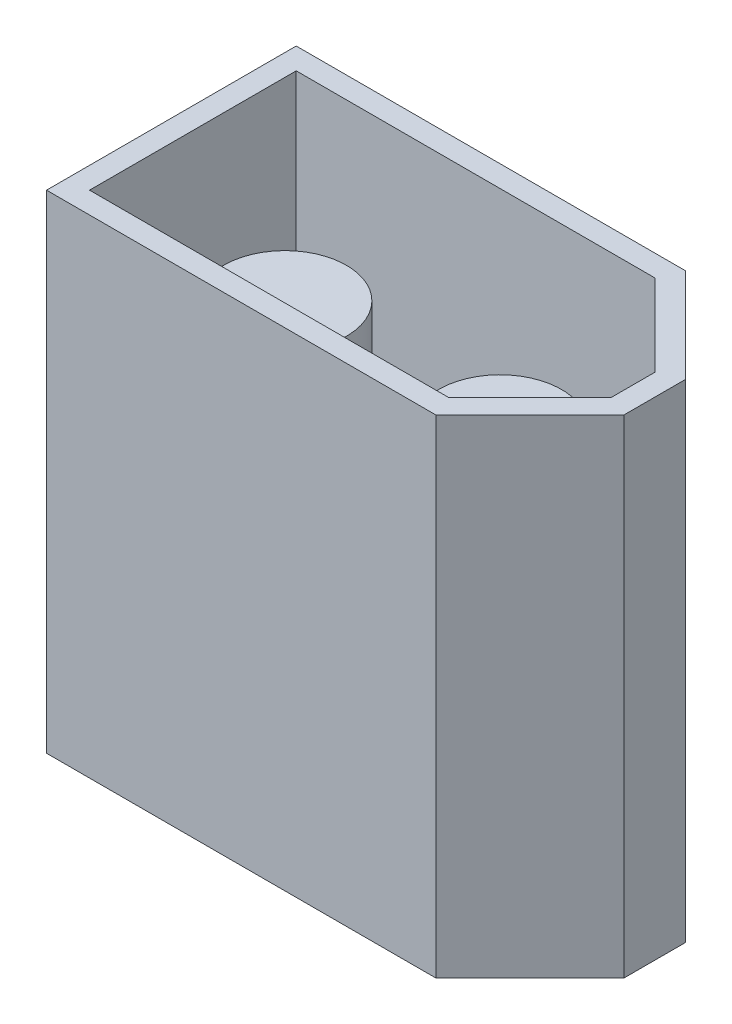
ISO-10303-21;
HEADER;
FILE_DESCRIPTION(('STEP AP214'),'2;1');
FILE_NAME('part.step','',(''),(''),'','','');
FILE_SCHEMA(('AUTOMOTIVE_DESIGN { 1 0 10303 214 1 1 1 1 }'));
ENDSEC;
DATA;
#1=APPLICATION_CONTEXT('core data for automotive mechanical design processes');
#2=APPLICATION_PROTOCOL_DEFINITION('international standard','automotive_design',2000,#1);
#3=PRODUCT_CONTEXT('',#1,'mechanical');
#4=PRODUCT('Part','Part','',(#3));
#5=PRODUCT_RELATED_PRODUCT_CATEGORY('part','',(#4));
#6=PRODUCT_DEFINITION_FORMATION('','',#4);
#7=PRODUCT_DEFINITION_CONTEXT('part definition',#1,'design');
#8=PRODUCT_DEFINITION('design','',#6,#7);
#9=PRODUCT_DEFINITION_SHAPE('','',#8);
#10=(LENGTH_UNIT() NAMED_UNIT(*) SI_UNIT(.MILLI.,.METRE.));
#11=(NAMED_UNIT(*) PLANE_ANGLE_UNIT() SI_UNIT($,.RADIAN.));
#12=(NAMED_UNIT(*) SI_UNIT($,.STERADIAN.) SOLID_ANGLE_UNIT());
#13=UNCERTAINTY_MEASURE_WITH_UNIT(LENGTH_MEASURE(1.E-05),#10,'distance_accuracy_value','');
#14=(GEOMETRIC_REPRESENTATION_CONTEXT(3) GLOBAL_UNCERTAINTY_ASSIGNED_CONTEXT((#13)) GLOBAL_UNIT_ASSIGNED_CONTEXT((#10,
#11,#12)) REPRESENTATION_CONTEXT('',''));
#15=CARTESIAN_POINT('',(0.,0.,0.));
#16=DIRECTION('',(0.,0.,1.));
#17=DIRECTION('',(1.,0.,0.));
#18=AXIS2_PLACEMENT_3D('',#15,#16,#17);
#19=CARTESIAN_POINT('',(2.83235,-1.3,0.));
#20=DIRECTION('',(0.,1.,0.));
#21=DIRECTION('',(0.,0.,1.));
#22=AXIS2_PLACEMENT_3D('',#19,#20,#21);
#23=CYLINDRICAL_SURFACE('',#22,2.);
#24=CARTESIAN_POINT('',(2.83235,-1.3,0.));
#25=DIRECTION('',(0.,1.,0.));
#26=DIRECTION('',(0.,0.,1.));
#27=AXIS2_PLACEMENT_3D('',#24,#25,#26);
#28=CIRCLE('',#27,2.);
#29=CARTESIAN_POINT('',(2.83235,-1.3,2.));
#30=VERTEX_POINT('',#29);
#31=EDGE_CURVE('E11',#30,#30,#28,.T.);
#32=ORIENTED_EDGE('',*,*,#31,.T.);
#33=EDGE_LOOP('',(#32));
#34=FACE_BOUND('',#33,.T.);
#35=CARTESIAN_POINT('',(2.83235,12.575,0.));
#36=DIRECTION('',(0.,1.,0.));
#37=DIRECTION('',(0.,0.,1.));
#38=AXIS2_PLACEMENT_3D('',#35,#36,#37);
#39=CIRCLE('',#38,2.);
#40=CARTESIAN_POINT('',(2.83235,12.575,2.));
#41=VERTEX_POINT('',#40);
#42=EDGE_CURVE('E50',#41,#41,#39,.T.);
#43=ORIENTED_EDGE('',*,*,#42,.F.);
#44=EDGE_LOOP('',(#43));
#45=FACE_BOUND('',#44,.T.);
#46=ADVANCED_FACE('F44',(#34,#45),#23,.T.);
#47=CARTESIAN_POINT('',(2.83235,-1.3,0.));
#48=DIRECTION('',(0.,1.,0.));
#49=DIRECTION('',(0.,0.,1.));
#50=AXIS2_PLACEMENT_3D('',#47,#48,#49);
#51=PLANE('',#50);
#52=ORIENTED_EDGE('',*,*,#31,.F.);
#53=EDGE_LOOP('',(#52));
#54=FACE_BOUND('',#53,.T.);
#55=ADVANCED_FACE('F59',(#54),#51,.F.);
#56=CARTESIAN_POINT('',(2.83235,12.575,0.));
#57=DIRECTION('',(0.,1.,0.));
#58=DIRECTION('',(0.,0.,1.));
#59=AXIS2_PLACEMENT_3D('',#56,#57,#58);
#60=PLANE('',#59);
#61=ORIENTED_EDGE('',*,*,#42,.T.);
#62=EDGE_LOOP('',(#61));
#63=FACE_BOUND('',#62,.T.);
#64=ADVANCED_FACE('F56',(#63),#60,.T.);
#65=CLOSED_SHELL('',(#46,#55,#64));
#66=MANIFOLD_SOLID_BREP('B2',#65);
#67=CARTESIAN_POINT('',(-4.16765,-1.3,0.));
#68=DIRECTION('',(0.,1.,0.));
#69=DIRECTION('',(0.,0.,1.));
#70=AXIS2_PLACEMENT_3D('',#67,#68,#69);
#71=CYLINDRICAL_SURFACE('',#70,2.);
#72=CARTESIAN_POINT('',(-4.16765,-1.3,0.));
#73=DIRECTION('',(0.,1.,0.));
#74=DIRECTION('',(0.,0.,1.));
#75=AXIS2_PLACEMENT_3D('',#72,#73,#74);
#76=CIRCLE('',#75,2.);
#77=CARTESIAN_POINT('',(-4.16765,-1.3,2.));
#78=VERTEX_POINT('',#77);
#79=EDGE_CURVE('E43',#78,#78,#76,.T.);
#80=ORIENTED_EDGE('',*,*,#79,.T.);
#81=EDGE_LOOP('',(#80));
#82=FACE_BOUND('',#81,.T.);
#83=CARTESIAN_POINT('',(-4.16765,12.575,0.));
#84=DIRECTION('',(0.,1.,0.));
#85=DIRECTION('',(0.,0.,1.));
#86=AXIS2_PLACEMENT_3D('',#83,#84,#85);
#87=CIRCLE('',#86,2.);
#88=CARTESIAN_POINT('',(-4.16765,12.575,2.));
#89=VERTEX_POINT('',#88);
#90=EDGE_CURVE('E100',#89,#89,#87,.T.);
#91=ORIENTED_EDGE('',*,*,#90,.F.);
#92=EDGE_LOOP('',(#91));
#93=FACE_BOUND('',#92,.T.);
#94=ADVANCED_FACE('F94',(#82,#93),#71,.T.);
#95=CARTESIAN_POINT('',(-4.16765,-1.3,0.));
#96=DIRECTION('',(0.,1.,0.));
#97=DIRECTION('',(0.,0.,1.));
#98=AXIS2_PLACEMENT_3D('',#95,#96,#97);
#99=PLANE('',#98);
#100=ORIENTED_EDGE('',*,*,#79,.F.);
#101=EDGE_LOOP('',(#100));
#102=FACE_BOUND('',#101,.T.);
#103=ADVANCED_FACE('F109',(#102),#99,.F.);
#104=CARTESIAN_POINT('',(-4.16765,12.575,0.));
#105=DIRECTION('',(0.,1.,0.));
#106=DIRECTION('',(0.,0.,1.));
#107=AXIS2_PLACEMENT_3D('',#104,#105,#106);
#108=PLANE('',#107);
#109=ORIENTED_EDGE('',*,*,#90,.T.);
#110=EDGE_LOOP('',(#109));
#111=FACE_BOUND('',#110,.T.);
#112=ADVANCED_FACE('F106',(#111),#108,.T.);
#113=CLOSED_SHELL('',(#94,#103,#112));
#114=MANIFOLD_SOLID_BREP('B6',#113);
#115=CARTESIAN_POINT('',(-7.86765,15.875,4.064));
#116=DIRECTION('',(0.,0.,-1.));
#117=DIRECTION('',(-1.,0.,0.));
#118=AXIS2_PLACEMENT_3D('',#115,#116,#117);
#119=PLANE('',#118);
#120=DIRECTION('',(1.,0.,0.));
#121=VECTOR('',#120,1.);
#122=CARTESIAN_POINT('',(-7.86765,0.,4.064));
#123=LINE('',#122,#121);
#124=CARTESIAN_POINT('',(-7.86765,0.,4.064));
#125=VERTEX_POINT('',#124);
#126=CARTESIAN_POINT('',(4.80365000000001,0.,4.064));
#127=VERTEX_POINT('',#126);
#128=EDGE_CURVE('E230',#125,#127,#123,.T.);
#129=ORIENTED_EDGE('',*,*,#128,.T.);
#130=DIRECTION('',(0.,-1.,0.));
#131=VECTOR('',#130,1.);
#132=CARTESIAN_POINT('',(4.80365000000001,15.875,4.064));
#133=LINE('',#132,#131);
#134=CARTESIAN_POINT('',(4.80365000000001,15.875,4.064));
#135=VERTEX_POINT('',#134);
#136=EDGE_CURVE('E92',#135,#127,#133,.T.);
#137=ORIENTED_EDGE('',*,*,#136,.F.);
#138=DIRECTION('',(1.,0.,0.));
#139=VECTOR('',#138,1.);
#140=CARTESIAN_POINT('',(-7.86765,15.875,4.064));
#141=LINE('',#140,#139);
#142=CARTESIAN_POINT('',(-7.86765,15.875,4.064));
#143=VERTEX_POINT('',#142);
#144=EDGE_CURVE('E242',#143,#135,#141,.T.);
#145=ORIENTED_EDGE('',*,*,#144,.F.);
#146=DIRECTION('',(0.,-1.,0.));
#147=VECTOR('',#146,1.);
#148=CARTESIAN_POINT('',(-7.86765,15.875,4.064));
#149=LINE('',#148,#147);
#150=EDGE_CURVE('E226',#143,#125,#149,.T.);
#151=ORIENTED_EDGE('',*,*,#150,.T.);
#152=EDGE_LOOP('',(#129,#137,#145,#151));
#153=FACE_BOUND('',#152,.T.);
#154=ADVANCED_FACE('F135',(#153),#119,.F.);
#155=CARTESIAN_POINT('',(4.80365000000001,15.875,4.064));
#156=DIRECTION('',(-0.707106781186549,0.,-0.707106781186546));
#157=DIRECTION('',(-0.707106781186546,0.,0.707106781186549));
#158=AXIS2_PLACEMENT_3D('',#155,#156,#157);
#159=PLANE('',#158);
#160=DIRECTION('',(0.707106781186546,0.,-0.707106781186549));
#161=VECTOR('',#160,1.);
#162=CARTESIAN_POINT('',(4.80365000000001,0.,4.064));
#163=LINE('',#162,#161);
#164=CARTESIAN_POINT('',(7.86765,0.,1.));
#165=VERTEX_POINT('',#164);
#166=EDGE_CURVE('E233',#127,#165,#163,.T.);
#167=ORIENTED_EDGE('',*,*,#166,.T.);
#168=DIRECTION('',(0.,-1.,0.));
#169=VECTOR('',#168,1.);
#170=CARTESIAN_POINT('',(7.86765,15.875,1.));
#171=LINE('',#170,#169);
#172=CARTESIAN_POINT('',(7.86765,15.875,1.));
#173=VERTEX_POINT('',#172);
#174=EDGE_CURVE('E142',#173,#165,#171,.T.);
#175=ORIENTED_EDGE('',*,*,#174,.F.);
#176=DIRECTION('',(0.707106781186546,0.,-0.707106781186549));
#177=VECTOR('',#176,1.);
#178=CARTESIAN_POINT('',(4.80365000000001,15.875,4.064));
#179=LINE('',#178,#177);
#180=EDGE_CURVE('E193',#135,#173,#179,.T.);
#181=ORIENTED_EDGE('',*,*,#180,.F.);
#182=ORIENTED_EDGE('',*,*,#136,.T.);
#183=EDGE_LOOP('',(#167,#175,#181,#182));
#184=FACE_BOUND('',#183,.T.);
#185=ADVANCED_FACE('F365',(#184),#159,.F.);
#186=CARTESIAN_POINT('',(7.86765,15.875,1.));
#187=DIRECTION('',(-1.,0.,0.));
#188=DIRECTION('',(0.,0.,1.));
#189=AXIS2_PLACEMENT_3D('',#186,#187,#188);
#190=PLANE('',#189);
#191=DIRECTION('',(0.,0.,-1.));
#192=VECTOR('',#191,1.);
#193=CARTESIAN_POINT('',(7.86765,0.,1.));
#194=LINE('',#193,#192);
#195=CARTESIAN_POINT('',(7.86765,0.,-1.));
#196=VERTEX_POINT('',#195);
#197=EDGE_CURVE('E236',#165,#196,#194,.T.);
#198=ORIENTED_EDGE('',*,*,#197,.T.);
#199=DIRECTION('',(0.,-1.,0.));
#200=VECTOR('',#199,1.);
#201=CARTESIAN_POINT('',(7.86765,15.875,-1.));
#202=LINE('',#201,#200);
#203=CARTESIAN_POINT('',(7.86765,15.875,-1.));
#204=VERTEX_POINT('',#203);
#205=EDGE_CURVE('E221',#204,#196,#202,.T.);
#206=ORIENTED_EDGE('',*,*,#205,.F.);
#207=DIRECTION('',(0.,0.,-1.));
#208=VECTOR('',#207,1.);
#209=CARTESIAN_POINT('',(7.86765,15.875,1.));
#210=LINE('',#209,#208);
#211=EDGE_CURVE('E209',#173,#204,#210,.T.);
#212=ORIENTED_EDGE('',*,*,#211,.F.);
#213=ORIENTED_EDGE('',*,*,#174,.T.);
#214=EDGE_LOOP('',(#198,#206,#212,#213));
#215=FACE_BOUND('',#214,.T.);
#216=ADVANCED_FACE('F248',(#215),#190,.F.);
#217=CARTESIAN_POINT('',(4.80365000000001,15.875,-4.064));
#218=DIRECTION('',(-0.707106781186549,0.,0.707106781186546));
#219=DIRECTION('',(0.707106781186546,0.,0.707106781186549));
#220=AXIS2_PLACEMENT_3D('',#217,#218,#219);
#221=PLANE('',#220);
#222=DIRECTION('',(-0.707106781186546,0.,-0.707106781186549));
#223=VECTOR('',#222,1.);
#224=CARTESIAN_POINT('',(4.80365000000001,0.,-4.064));
#225=LINE('',#224,#223);
#226=CARTESIAN_POINT('',(4.80365000000001,0.,-4.064));
#227=VERTEX_POINT('',#226);
#228=EDGE_CURVE('E218',#196,#227,#225,.T.);
#229=ORIENTED_EDGE('',*,*,#228,.T.);
#230=DIRECTION('',(0.,-1.,0.));
#231=VECTOR('',#230,1.);
#232=CARTESIAN_POINT('',(4.80365000000001,15.875,-4.064));
#233=LINE('',#232,#231);
#234=CARTESIAN_POINT('',(4.80365000000001,15.875,-4.064));
#235=VERTEX_POINT('',#234);
#236=EDGE_CURVE('E215',#235,#227,#233,.T.);
#237=ORIENTED_EDGE('',*,*,#236,.F.);
#238=DIRECTION('',(-0.707106781186546,0.,-0.707106781186549));
#239=VECTOR('',#238,1.);
#240=CARTESIAN_POINT('',(4.80365000000001,15.875,-4.064));
#241=LINE('',#240,#239);
#242=EDGE_CURVE('E202',#204,#235,#241,.T.);
#243=ORIENTED_EDGE('',*,*,#242,.F.);
#244=ORIENTED_EDGE('',*,*,#205,.T.);
#245=EDGE_LOOP('',(#229,#237,#243,#244));
#246=FACE_BOUND('',#245,.T.);
#247=ADVANCED_FACE('F216',(#246),#221,.F.);
#248=CARTESIAN_POINT('',(-7.86765,15.875,-4.064));
#249=DIRECTION('',(0.,0.,1.));
#250=DIRECTION('',(1.,0.,0.));
#251=AXIS2_PLACEMENT_3D('',#248,#249,#250);
#252=PLANE('',#251);
#253=DIRECTION('',(-1.,0.,0.));
#254=VECTOR('',#253,1.);
#255=CARTESIAN_POINT('',(-7.86765,0.,-4.064));
#256=LINE('',#255,#254);
#257=CARTESIAN_POINT('',(-7.86765,0.,-4.064));
#258=VERTEX_POINT('',#257);
#259=EDGE_CURVE('E239',#227,#258,#256,.T.);
#260=ORIENTED_EDGE('',*,*,#259,.T.);
#261=DIRECTION('',(0.,-1.,0.));
#262=VECTOR('',#261,1.);
#263=CARTESIAN_POINT('',(-7.86765,15.875,-4.064));
#264=LINE('',#263,#262);
#265=CARTESIAN_POINT('',(-7.86765,15.875,-4.064));
#266=VERTEX_POINT('',#265);
#267=EDGE_CURVE('E222',#266,#258,#264,.T.);
#268=ORIENTED_EDGE('',*,*,#267,.F.);
#269=DIRECTION('',(-1.,0.,0.));
#270=VECTOR('',#269,1.);
#271=CARTESIAN_POINT('',(-7.86765,15.875,-4.064));
#272=LINE('',#271,#270);
#273=EDGE_CURVE('E206',#235,#266,#272,.T.);
#274=ORIENTED_EDGE('',*,*,#273,.F.);
#275=ORIENTED_EDGE('',*,*,#236,.T.);
#276=EDGE_LOOP('',(#260,#268,#274,#275));
#277=FACE_BOUND('',#276,.T.);
#278=ADVANCED_FACE('F224',(#277),#252,.F.);
#279=CARTESIAN_POINT('',(-7.86765,15.875,-4.064));
#280=DIRECTION('',(1.,0.,0.));
#281=DIRECTION('',(0.,0.,-1.));
#282=AXIS2_PLACEMENT_3D('',#279,#280,#281);
#283=PLANE('',#282);
#284=DIRECTION('',(0.,0.,1.));
#285=VECTOR('',#284,1.);
#286=CARTESIAN_POINT('',(-7.86765,0.,-4.064));
#287=LINE('',#286,#285);
#288=EDGE_CURVE('E185',#258,#125,#287,.T.);
#289=ORIENTED_EDGE('',*,*,#288,.T.);
#290=ORIENTED_EDGE('',*,*,#150,.F.);
#291=DIRECTION('',(0.,0.,1.));
#292=VECTOR('',#291,1.);
#293=CARTESIAN_POINT('',(-7.86765,15.875,-4.064));
#294=LINE('',#293,#292);
#295=EDGE_CURVE('E158',#266,#143,#294,.T.);
#296=ORIENTED_EDGE('',*,*,#295,.F.);
#297=ORIENTED_EDGE('',*,*,#267,.T.);
#298=EDGE_LOOP('',(#289,#290,#296,#297));
#299=FACE_BOUND('',#298,.T.);
#300=ADVANCED_FACE('F252',(#299),#283,.F.);
#301=CARTESIAN_POINT('',(7.86765,15.875,4.064));
#302=DIRECTION('',(0.,1.,0.));
#303=DIRECTION('',(0.,0.,1.));
#304=AXIS2_PLACEMENT_3D('',#301,#302,#303);
#305=PLANE('',#304);
#306=DIRECTION('',(1.,0.,0.));
#307=VECTOR('',#306,1.);
#308=CARTESIAN_POINT('',(-7.86765,15.875,3.364));
#309=LINE('',#308,#307);
#310=CARTESIAN_POINT('',(-7.16765,15.875,3.364));
#311=VERTEX_POINT('',#310);
#312=CARTESIAN_POINT('',(4.51370050633884,15.875,3.364));
#313=VERTEX_POINT('',#312);
#314=EDGE_CURVE('E273',#311,#313,#309,.T.);
#315=ORIENTED_EDGE('',*,*,#314,.F.);
#316=DIRECTION('',(0.,0.,1.));
#317=VECTOR('',#316,1.);
#318=CARTESIAN_POINT('',(-7.16765,15.875,-4.064));
#319=LINE('',#318,#317);
#320=CARTESIAN_POINT('',(-7.16765,15.875,-3.364));
#321=VERTEX_POINT('',#320);
#322=EDGE_CURVE('E259',#321,#311,#319,.T.);
#323=ORIENTED_EDGE('',*,*,#322,.F.);
#324=DIRECTION('',(-1.,0.,0.));
#325=VECTOR('',#324,1.);
#326=CARTESIAN_POINT('',(-7.86765,15.875,-3.364));
#327=LINE('',#326,#325);
#328=CARTESIAN_POINT('',(4.51370050633884,15.875,-3.364));
#329=VERTEX_POINT('',#328);
#330=EDGE_CURVE('E262',#329,#321,#327,.T.);
#331=ORIENTED_EDGE('',*,*,#330,.F.);
#332=DIRECTION('',(-0.707106781186546,0.,-0.707106781186549));
#333=VECTOR('',#332,1.);
#334=CARTESIAN_POINT('',(4.30867525316943,15.875,-3.56902525316942));
#335=LINE('',#334,#333);
#336=CARTESIAN_POINT('',(7.16765,15.875,-0.710050506338834));
#337=VERTEX_POINT('',#336);
#338=EDGE_CURVE('E264',#337,#329,#335,.T.);
#339=ORIENTED_EDGE('',*,*,#338,.F.);
#340=DIRECTION('',(0.,0.,-1.));
#341=VECTOR('',#340,1.);
#342=CARTESIAN_POINT('',(7.16765,15.875,1.));
#343=LINE('',#342,#341);
#344=CARTESIAN_POINT('',(7.16765,15.875,0.710050506338834));
#345=VERTEX_POINT('',#344);
#346=EDGE_CURVE('E267',#345,#337,#343,.T.);
#347=ORIENTED_EDGE('',*,*,#346,.F.);
#348=DIRECTION('',(0.707106781186546,0.,-0.707106781186549));
#349=VECTOR('',#348,1.);
#350=CARTESIAN_POINT('',(4.30867525316943,15.875,3.56902525316942));
#351=LINE('',#350,#349);
#352=EDGE_CURVE('E270',#313,#345,#351,.T.);
#353=ORIENTED_EDGE('',*,*,#352,.F.);
#354=EDGE_LOOP('',(#315,#323,#331,#339,#347,#353));
#355=FACE_BOUND('',#354,.T.);
#356=ORIENTED_EDGE('',*,*,#144,.T.);
#357=ORIENTED_EDGE('',*,*,#180,.T.);
#358=ORIENTED_EDGE('',*,*,#211,.T.);
#359=ORIENTED_EDGE('',*,*,#242,.T.);
#360=ORIENTED_EDGE('',*,*,#273,.T.);
#361=ORIENTED_EDGE('',*,*,#295,.T.);
#362=EDGE_LOOP('',(#356,#357,#358,#359,#360,#361));
#363=FACE_BOUND('',#362,.T.);
#364=ADVANCED_FACE('F204',(#355,#363),#305,.T.);
#365=CARTESIAN_POINT('',(7.86765,0.,4.064));
#366=DIRECTION('',(0.,1.,0.));
#367=DIRECTION('',(0.,0.,1.));
#368=AXIS2_PLACEMENT_3D('',#365,#366,#367);
#369=PLANE('',#368);
#370=ORIENTED_EDGE('',*,*,#128,.F.);
#371=ORIENTED_EDGE('',*,*,#288,.F.);
#372=ORIENTED_EDGE('',*,*,#259,.F.);
#373=ORIENTED_EDGE('',*,*,#228,.F.);
#374=ORIENTED_EDGE('',*,*,#197,.F.);
#375=ORIENTED_EDGE('',*,*,#166,.F.);
#376=EDGE_LOOP('',(#370,#371,#372,#373,#374,#375));
#377=FACE_BOUND('',#376,.T.);
#378=ADVANCED_FACE('F251',(#377),#369,.F.);
#379=CARTESIAN_POINT('',(-7.86765,15.875,3.364));
#380=DIRECTION('',(0.,0.,-1.));
#381=DIRECTION('',(-1.,0.,0.));
#382=AXIS2_PLACEMENT_3D('',#379,#380,#381);
#383=PLANE('',#382);
#384=DIRECTION('',(1.,0.,0.));
#385=VECTOR('',#384,1.);
#386=CARTESIAN_POINT('',(-7.86765,0.699999999999999,3.364));
#387=LINE('',#386,#385);
#388=CARTESIAN_POINT('',(-7.16765,0.7,3.364));
#389=VERTEX_POINT('',#388);
#390=CARTESIAN_POINT('',(4.51370050633884,0.7,3.364));
#391=VERTEX_POINT('',#390);
#392=EDGE_CURVE('E301',#389,#391,#387,.T.);
#393=ORIENTED_EDGE('',*,*,#392,.F.);
#394=DIRECTION('',(0.,-1.,0.));
#395=VECTOR('',#394,1.);
#396=CARTESIAN_POINT('',(-7.16765,15.875,3.364));
#397=LINE('',#396,#395);
#398=EDGE_CURVE('E261',#311,#389,#397,.T.);
#399=ORIENTED_EDGE('',*,*,#398,.F.);
#400=ORIENTED_EDGE('',*,*,#314,.T.);
#401=DIRECTION('',(0.,-1.,0.));
#402=VECTOR('',#401,1.);
#403=CARTESIAN_POINT('',(4.51370050633884,15.875,3.364));
#404=LINE('',#403,#402);
#405=EDGE_CURVE('E234',#313,#391,#404,.T.);
#406=ORIENTED_EDGE('',*,*,#405,.T.);
#407=EDGE_LOOP('',(#393,#399,#400,#406));
#408=FACE_BOUND('',#407,.T.);
#409=ADVANCED_FACE('F317',(#408),#383,.T.);
#410=CARTESIAN_POINT('',(4.30867525316943,15.875,3.56902525316942));
#411=DIRECTION('',(-0.707106781186549,0.,-0.707106781186546));
#412=DIRECTION('',(-0.707106781186546,0.,0.707106781186549));
#413=AXIS2_PLACEMENT_3D('',#410,#411,#412);
#414=PLANE('',#413);
#415=DIRECTION('',(0.707106781186546,0.,-0.707106781186549));
#416=VECTOR('',#415,1.);
#417=CARTESIAN_POINT('',(4.30867525316943,0.699999999999999,3.56902525316942));
#418=LINE('',#417,#416);
#419=CARTESIAN_POINT('',(7.16765,0.7,0.710050506338834));
#420=VERTEX_POINT('',#419);
#421=EDGE_CURVE('E296',#391,#420,#418,.T.);
#422=ORIENTED_EDGE('',*,*,#421,.F.);
#423=ORIENTED_EDGE('',*,*,#405,.F.);
#424=ORIENTED_EDGE('',*,*,#352,.T.);
#425=DIRECTION('',(0.,-1.,0.));
#426=VECTOR('',#425,1.);
#427=CARTESIAN_POINT('',(7.16765,15.875,0.710050506338834));
#428=LINE('',#427,#426);
#429=EDGE_CURVE('E293',#345,#420,#428,.T.);
#430=ORIENTED_EDGE('',*,*,#429,.T.);
#431=EDGE_LOOP('',(#422,#423,#424,#430));
#432=FACE_BOUND('',#431,.T.);
#433=ADVANCED_FACE('F343',(#432),#414,.T.);
#434=CARTESIAN_POINT('',(7.16765,15.875,1.));
#435=DIRECTION('',(-1.,0.,0.));
#436=DIRECTION('',(0.,0.,1.));
#437=AXIS2_PLACEMENT_3D('',#434,#435,#436);
#438=PLANE('',#437);
#439=DIRECTION('',(0.,0.,-1.));
#440=VECTOR('',#439,1.);
#441=CARTESIAN_POINT('',(7.16765,0.699999999999999,1.));
#442=LINE('',#441,#440);
#443=CARTESIAN_POINT('',(7.16765,0.7,-0.710050506338834));
#444=VERTEX_POINT('',#443);
#445=EDGE_CURVE('E290',#420,#444,#442,.T.);
#446=ORIENTED_EDGE('',*,*,#445,.F.);
#447=ORIENTED_EDGE('',*,*,#429,.F.);
#448=ORIENTED_EDGE('',*,*,#346,.T.);
#449=DIRECTION('',(0.,-1.,0.));
#450=VECTOR('',#449,1.);
#451=CARTESIAN_POINT('',(7.16765,15.875,-0.710050506338834));
#452=LINE('',#451,#450);
#453=EDGE_CURVE('E287',#337,#444,#452,.T.);
#454=ORIENTED_EDGE('',*,*,#453,.T.);
#455=EDGE_LOOP('',(#446,#447,#448,#454));
#456=FACE_BOUND('',#455,.T.);
#457=ADVANCED_FACE('F349',(#456),#438,.T.);
#458=CARTESIAN_POINT('',(4.30867525316943,15.875,-3.56902525316942));
#459=DIRECTION('',(-0.707106781186549,0.,0.707106781186546));
#460=DIRECTION('',(0.707106781186546,0.,0.707106781186549));
#461=AXIS2_PLACEMENT_3D('',#458,#459,#460);
#462=PLANE('',#461);
#463=DIRECTION('',(-0.707106781186546,0.,-0.707106781186549));
#464=VECTOR('',#463,1.);
#465=CARTESIAN_POINT('',(4.30867525316943,0.699999999999999,-3.56902525316942));
#466=LINE('',#465,#464);
#467=CARTESIAN_POINT('',(4.51370050633884,0.7,-3.364));
#468=VERTEX_POINT('',#467);
#469=EDGE_CURVE('E284',#444,#468,#466,.T.);
#470=ORIENTED_EDGE('',*,*,#469,.F.);
#471=ORIENTED_EDGE('',*,*,#453,.F.);
#472=ORIENTED_EDGE('',*,*,#338,.T.);
#473=DIRECTION('',(0.,-1.,0.));
#474=VECTOR('',#473,1.);
#475=CARTESIAN_POINT('',(4.51370050633885,15.875,-3.364));
#476=LINE('',#475,#474);
#477=EDGE_CURVE('E281',#329,#468,#476,.T.);
#478=ORIENTED_EDGE('',*,*,#477,.T.);
#479=EDGE_LOOP('',(#470,#471,#472,#478));
#480=FACE_BOUND('',#479,.T.);
#481=ADVANCED_FACE('F353',(#480),#462,.T.);
#482=CARTESIAN_POINT('',(-7.86765,15.875,-3.364));
#483=DIRECTION('',(0.,0.,1.));
#484=DIRECTION('',(1.,0.,0.));
#485=AXIS2_PLACEMENT_3D('',#482,#483,#484);
#486=PLANE('',#485);
#487=DIRECTION('',(-1.,0.,0.));
#488=VECTOR('',#487,1.);
#489=CARTESIAN_POINT('',(-7.86765,0.699999999999999,-3.364));
#490=LINE('',#489,#488);
#491=CARTESIAN_POINT('',(-7.16765,0.7,-3.364));
#492=VERTEX_POINT('',#491);
#493=EDGE_CURVE('E279',#468,#492,#490,.T.);
#494=ORIENTED_EDGE('',*,*,#493,.F.);
#495=ORIENTED_EDGE('',*,*,#477,.F.);
#496=ORIENTED_EDGE('',*,*,#330,.T.);
#497=DIRECTION('',(0.,-1.,0.));
#498=VECTOR('',#497,1.);
#499=CARTESIAN_POINT('',(-7.16765,15.875,-3.364));
#500=LINE('',#499,#498);
#501=EDGE_CURVE('E149',#321,#492,#500,.T.);
#502=ORIENTED_EDGE('',*,*,#501,.T.);
#503=EDGE_LOOP('',(#494,#495,#496,#502));
#504=FACE_BOUND('',#503,.T.);
#505=ADVANCED_FACE('F355',(#504),#486,.T.);
#506=CARTESIAN_POINT('',(-7.16765,15.875,-4.064));
#507=DIRECTION('',(1.,0.,0.));
#508=DIRECTION('',(0.,0.,-1.));
#509=AXIS2_PLACEMENT_3D('',#506,#507,#508);
#510=PLANE('',#509);
#511=DIRECTION('',(0.,0.,1.));
#512=VECTOR('',#511,1.);
#513=CARTESIAN_POINT('',(-7.16765,0.699999999999999,-4.064));
#514=LINE('',#513,#512);
#515=EDGE_CURVE('E276',#492,#389,#514,.T.);
#516=ORIENTED_EDGE('',*,*,#515,.F.);
#517=ORIENTED_EDGE('',*,*,#501,.F.);
#518=ORIENTED_EDGE('',*,*,#322,.T.);
#519=ORIENTED_EDGE('',*,*,#398,.T.);
#520=EDGE_LOOP('',(#516,#517,#518,#519));
#521=FACE_BOUND('',#520,.T.);
#522=ADVANCED_FACE('F337',(#521),#510,.T.);
#523=CARTESIAN_POINT('',(7.86765,0.7,4.064));
#524=DIRECTION('',(0.,1.,0.));
#525=DIRECTION('',(0.,0.,1.));
#526=AXIS2_PLACEMENT_3D('',#523,#524,#525);
#527=PLANE('',#526);
#528=ORIENTED_EDGE('',*,*,#392,.T.);
#529=ORIENTED_EDGE('',*,*,#421,.T.);
#530=ORIENTED_EDGE('',*,*,#445,.T.);
#531=ORIENTED_EDGE('',*,*,#469,.T.);
#532=ORIENTED_EDGE('',*,*,#493,.T.);
#533=ORIENTED_EDGE('',*,*,#515,.T.);
#534=EDGE_LOOP('',(#528,#529,#530,#531,#532,#533));
#535=FACE_BOUND('',#534,.T.);
#536=ADVANCED_FACE('F310',(#535),#527,.T.);
#537=CLOSED_SHELL('',(#154,#185,#216,#247,#278,#300,#364,#378,#409,#433,#457,#481,#505,#522,#536));
#538=MANIFOLD_SOLID_BREP('B38',#537);
#539=ADVANCED_BREP_SHAPE_REPRESENTATION('',(#18,#66,#114,#538),#14);
#540=SHAPE_DEFINITION_REPRESENTATION(#9,#539);
ENDSEC;
END-ISO-10303-21;
